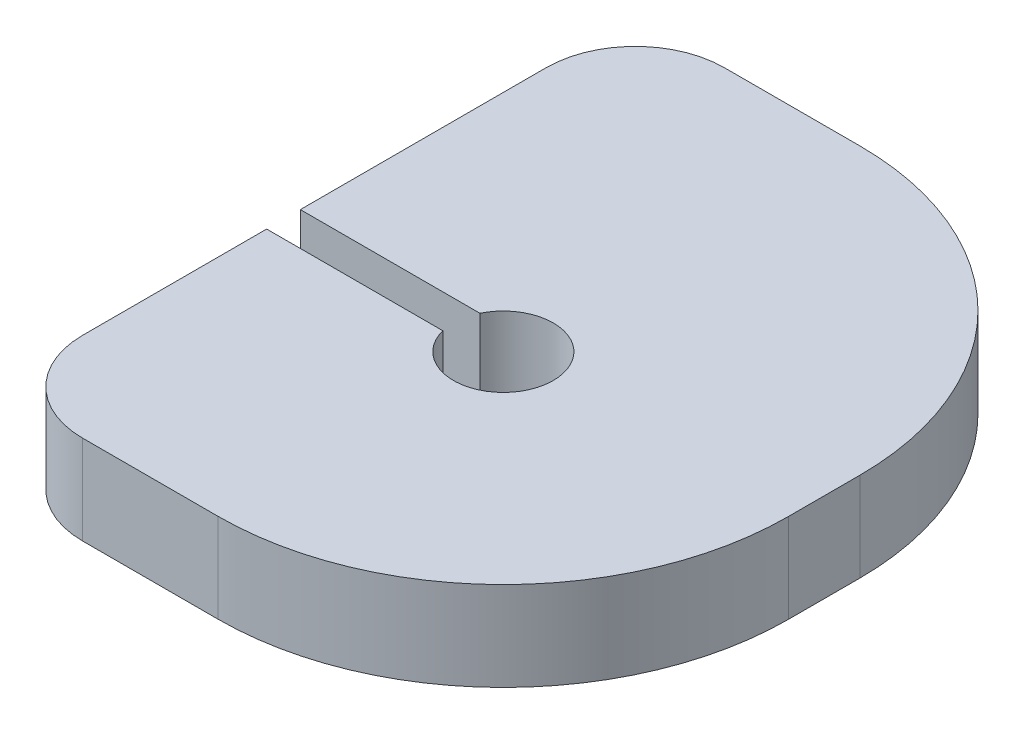
ISO-10303-21;
HEADER;
FILE_DESCRIPTION(('STEP AP214'),'2;1');
FILE_NAME('part.step','',(''),(''),'','','');
FILE_SCHEMA(('AUTOMOTIVE_DESIGN { 1 0 10303 214 1 1 1 1 }'));
ENDSEC;
DATA;
#1=APPLICATION_CONTEXT('core data for automotive mechanical design processes');
#2=APPLICATION_PROTOCOL_DEFINITION('international standard','automotive_design',2000,#1);
#3=PRODUCT_CONTEXT('',#1,'mechanical');
#4=PRODUCT('Part','Part','',(#3));
#5=PRODUCT_RELATED_PRODUCT_CATEGORY('part','',(#4));
#6=PRODUCT_DEFINITION_FORMATION('','',#4);
#7=PRODUCT_DEFINITION_CONTEXT('part definition',#1,'design');
#8=PRODUCT_DEFINITION('design','',#6,#7);
#9=PRODUCT_DEFINITION_SHAPE('','',#8);
#10=(LENGTH_UNIT() NAMED_UNIT(*) SI_UNIT(.MILLI.,.METRE.));
#11=(NAMED_UNIT(*) PLANE_ANGLE_UNIT() SI_UNIT($,.RADIAN.));
#12=(NAMED_UNIT(*) SI_UNIT($,.STERADIAN.) SOLID_ANGLE_UNIT());
#13=UNCERTAINTY_MEASURE_WITH_UNIT(LENGTH_MEASURE(1.E-05),#10,'distance_accuracy_value','');
#14=(GEOMETRIC_REPRESENTATION_CONTEXT(3) GLOBAL_UNCERTAINTY_ASSIGNED_CONTEXT((#13)) GLOBAL_UNIT_ASSIGNED_CONTEXT((#10,
#11,#12)) REPRESENTATION_CONTEXT('',''));
#15=CARTESIAN_POINT('',(0.,0.,0.));
#16=DIRECTION('',(0.,0.,1.));
#17=DIRECTION('',(1.,0.,0.));
#18=AXIS2_PLACEMENT_3D('',#15,#16,#17);
#19=CARTESIAN_POINT('',(0.,3.175,0.));
#20=DIRECTION('',(0.,1.,0.));
#21=DIRECTION('',(0.,0.,1.));
#22=AXIS2_PLACEMENT_3D('',#19,#20,#21);
#23=PLANE('',#22);
#24=DIRECTION('',(0.,0.,-1.));
#25=VECTOR('',#24,1.);
#26=CARTESIAN_POINT('',(7.23899999999999,3.175,-11.43));
#27=LINE('',#26,#25);
#28=CARTESIAN_POINT('',(7.239,3.175,0.500889408729022));
#29=VERTEX_POINT('',#28);
#30=CARTESIAN_POINT('',(7.23899999999999,3.175,-8.255));
#31=VERTEX_POINT('',#30);
#32=EDGE_CURVE('E147',#29,#31,#27,.T.);
#33=ORIENTED_EDGE('',*,*,#32,.F.);
#34=DIRECTION('',(1.,0.,0.));
#35=VECTOR('',#34,1.);
#36=CARTESIAN_POINT('',(7.239,3.175,0.500889408729023));
#37=LINE('',#36,#35);
#38=CARTESIAN_POINT('',(13.6369551165377,3.175,0.500889408729023));
#39=VERTEX_POINT('',#38);
#40=EDGE_CURVE('E47',#29,#39,#37,.T.);
#41=ORIENTED_EDGE('',*,*,#40,.T.);
#42=CARTESIAN_POINT('',(15.24,3.175,1.27));
#43=DIRECTION('',(0.,1.,0.));
#44=DIRECTION('',(0.,0.,1.));
#45=AXIS2_PLACEMENT_3D('',#42,#43,#44);
#46=CIRCLE('',#45,1.778);
#47=CARTESIAN_POINT('',(13.5150019369735,3.175,1.70088940872902));
#48=VERTEX_POINT('',#47);
#49=EDGE_CURVE('E145',#48,#39,#46,.T.);
#50=ORIENTED_EDGE('',*,*,#49,.F.);
#51=DIRECTION('',(1.,0.,0.));
#52=VECTOR('',#51,1.);
#53=CARTESIAN_POINT('',(7.239,3.175,1.70088940872902));
#54=LINE('',#53,#52);
#55=CARTESIAN_POINT('',(7.239,3.175,1.70088940872902));
#56=VERTEX_POINT('',#55);
#57=EDGE_CURVE('E135',#56,#48,#54,.T.);
#58=ORIENTED_EDGE('',*,*,#57,.F.);
#59=CARTESIAN_POINT('',(7.239,3.175,8.255));
#60=VERTEX_POINT('',#59);
#61=EDGE_CURVE('E142',#60,#56,#27,.T.);
#62=ORIENTED_EDGE('',*,*,#61,.F.);
#63=CARTESIAN_POINT('',(10.414,3.175,8.255));
#64=DIRECTION('',(0.,1.,0.));
#65=DIRECTION('',(0.,0.,1.));
#66=AXIS2_PLACEMENT_3D('',#63,#64,#65);
#67=CIRCLE('',#66,3.175);
#68=CARTESIAN_POINT('',(10.414,3.175,11.43));
#69=VERTEX_POINT('',#68);
#70=EDGE_CURVE('E199',#60,#69,#67,.T.);
#71=ORIENTED_EDGE('',*,*,#70,.T.);
#72=DIRECTION('',(1.,0.,0.));
#73=VECTOR('',#72,1.);
#74=CARTESIAN_POINT('',(-25.4,3.175,11.43));
#75=LINE('',#74,#73);
#76=CARTESIAN_POINT('',(15.24,3.175,11.43));
#77=VERTEX_POINT('',#76);
#78=EDGE_CURVE('E157',#69,#77,#75,.T.);
#79=ORIENTED_EDGE('',*,*,#78,.T.);
#80=CARTESIAN_POINT('',(15.24,3.175,1.27));
#81=DIRECTION('',(0.,1.,0.));
#82=DIRECTION('',(0.,0.,1.));
#83=AXIS2_PLACEMENT_3D('',#80,#81,#82);
#84=CIRCLE('',#83,10.16);
#85=CARTESIAN_POINT('',(25.4,3.175,1.27));
#86=VERTEX_POINT('',#85);
#87=EDGE_CURVE('E178',#77,#86,#84,.T.);
#88=ORIENTED_EDGE('',*,*,#87,.T.);
#89=DIRECTION('',(0.,0.,-1.));
#90=VECTOR('',#89,1.);
#91=CARTESIAN_POINT('',(25.4,3.175,-11.43));
#92=LINE('',#91,#90);
#93=CARTESIAN_POINT('',(25.4,3.175,-1.27));
#94=VERTEX_POINT('',#93);
#95=EDGE_CURVE('E159',#86,#94,#92,.T.);
#96=ORIENTED_EDGE('',*,*,#95,.T.);
#97=CARTESIAN_POINT('',(15.24,3.175,-1.27));
#98=DIRECTION('',(0.,1.,0.));
#99=DIRECTION('',(0.,0.,1.));
#100=AXIS2_PLACEMENT_3D('',#97,#98,#99);
#101=CIRCLE('',#100,10.16);
#102=CARTESIAN_POINT('',(15.24,3.175,-11.43));
#103=VERTEX_POINT('',#102);
#104=EDGE_CURVE('E188',#94,#103,#101,.T.);
#105=ORIENTED_EDGE('',*,*,#104,.T.);
#106=DIRECTION('',(-1.,0.,0.));
#107=VECTOR('',#106,1.);
#108=CARTESIAN_POINT('',(-25.4,3.175,-11.43));
#109=LINE('',#108,#107);
#110=CARTESIAN_POINT('',(10.414,3.175,-11.43));
#111=VERTEX_POINT('',#110);
#112=EDGE_CURVE('E163',#103,#111,#109,.T.);
#113=ORIENTED_EDGE('',*,*,#112,.T.);
#114=CARTESIAN_POINT('',(10.414,3.175,-8.255));
#115=DIRECTION('',(0.,1.,0.));
#116=DIRECTION('',(0.,0.,1.));
#117=AXIS2_PLACEMENT_3D('',#114,#115,#116);
#118=CIRCLE('',#117,3.175);
#119=EDGE_CURVE('E196',#111,#31,#118,.T.);
#120=ORIENTED_EDGE('',*,*,#119,.T.);
#121=EDGE_LOOP('',(#33,#41,#50,#58,#62,#71,#79,#88,#96,#105,#113,#120));
#122=FACE_BOUND('',#121,.T.);
#123=ADVANCED_FACE('F32',(#122),#23,.T.);
#124=CARTESIAN_POINT('',(0.,0.,0.));
#125=DIRECTION('',(0.,1.,0.));
#126=DIRECTION('',(0.,0.,1.));
#127=AXIS2_PLACEMENT_3D('',#124,#125,#126);
#128=PLANE('',#127);
#129=DIRECTION('',(1.,0.,0.));
#130=VECTOR('',#129,1.);
#131=CARTESIAN_POINT('',(7.239,0.,0.500889408729023));
#132=LINE('',#131,#130);
#133=CARTESIAN_POINT('',(7.239,0.,0.500889408729023));
#134=VERTEX_POINT('',#133);
#135=CARTESIAN_POINT('',(13.6369551165377,0.,0.500889408729023));
#136=VERTEX_POINT('',#135);
#137=EDGE_CURVE('E121',#134,#136,#132,.T.);
#138=ORIENTED_EDGE('',*,*,#137,.F.);
#139=DIRECTION('',(0.,0.,-1.));
#140=VECTOR('',#139,1.);
#141=CARTESIAN_POINT('',(7.23899999999999,0.,-11.43));
#142=LINE('',#141,#140);
#143=CARTESIAN_POINT('',(7.23899999999999,0.,-8.255));
#144=VERTEX_POINT('',#143);
#145=EDGE_CURVE('E131',#134,#144,#142,.T.);
#146=ORIENTED_EDGE('',*,*,#145,.T.);
#147=CARTESIAN_POINT('',(10.414,0.,-8.255));
#148=DIRECTION('',(0.,1.,0.));
#149=DIRECTION('',(0.,0.,1.));
#150=AXIS2_PLACEMENT_3D('',#147,#148,#149);
#151=CIRCLE('',#150,3.175);
#152=CARTESIAN_POINT('',(10.414,0.,-11.43));
#153=VERTEX_POINT('',#152);
#154=EDGE_CURVE('E203',#144,#153,#151,.F.);
#155=ORIENTED_EDGE('',*,*,#154,.T.);
#156=DIRECTION('',(-1.,0.,0.));
#157=VECTOR('',#156,1.);
#158=CARTESIAN_POINT('',(-25.4,0.,-11.43));
#159=LINE('',#158,#157);
#160=CARTESIAN_POINT('',(15.24,0.,-11.43));
#161=VERTEX_POINT('',#160);
#162=EDGE_CURVE('E160',#161,#153,#159,.T.);
#163=ORIENTED_EDGE('',*,*,#162,.F.);
#164=CARTESIAN_POINT('',(15.24,0.,-1.27));
#165=DIRECTION('',(0.,1.,0.));
#166=DIRECTION('',(0.,0.,1.));
#167=AXIS2_PLACEMENT_3D('',#164,#165,#166);
#168=CIRCLE('',#167,10.16);
#169=CARTESIAN_POINT('',(25.4,0.,-1.27));
#170=VERTEX_POINT('',#169);
#171=EDGE_CURVE('E183',#161,#170,#168,.F.);
#172=ORIENTED_EDGE('',*,*,#171,.T.);
#173=DIRECTION('',(0.,0.,-1.));
#174=VECTOR('',#173,1.);
#175=CARTESIAN_POINT('',(25.4,0.,-11.43));
#176=LINE('',#175,#174);
#177=CARTESIAN_POINT('',(25.4,0.,1.27));
#178=VERTEX_POINT('',#177);
#179=EDGE_CURVE('E168',#178,#170,#176,.T.);
#180=ORIENTED_EDGE('',*,*,#179,.F.);
#181=CARTESIAN_POINT('',(15.24,0.,1.27));
#182=DIRECTION('',(0.,1.,0.));
#183=DIRECTION('',(0.,0.,1.));
#184=AXIS2_PLACEMENT_3D('',#181,#182,#183);
#185=CIRCLE('',#184,10.16);
#186=CARTESIAN_POINT('',(15.24,0.,11.43));
#187=VERTEX_POINT('',#186);
#188=EDGE_CURVE('E175',#178,#187,#185,.F.);
#189=ORIENTED_EDGE('',*,*,#188,.T.);
#190=DIRECTION('',(1.,0.,0.));
#191=VECTOR('',#190,1.);
#192=CARTESIAN_POINT('',(-25.4,0.,11.43));
#193=LINE('',#192,#191);
#194=CARTESIAN_POINT('',(10.414,0.,11.43));
#195=VERTEX_POINT('',#194);
#196=EDGE_CURVE('E154',#195,#187,#193,.T.);
#197=ORIENTED_EDGE('',*,*,#196,.F.);
#198=CARTESIAN_POINT('',(10.414,0.,8.255));
#199=DIRECTION('',(0.,1.,0.));
#200=DIRECTION('',(0.,0.,1.));
#201=AXIS2_PLACEMENT_3D('',#198,#199,#200);
#202=CIRCLE('',#201,3.175);
#203=CARTESIAN_POINT('',(7.239,0.,8.255));
#204=VERTEX_POINT('',#203);
#205=EDGE_CURVE('E40',#195,#204,#202,.F.);
#206=ORIENTED_EDGE('',*,*,#205,.T.);
#207=CARTESIAN_POINT('',(7.239,0.,1.70088940872902));
#208=VERTEX_POINT('',#207);
#209=EDGE_CURVE('E141',#204,#208,#142,.T.);
#210=ORIENTED_EDGE('',*,*,#209,.T.);
#211=DIRECTION('',(1.,0.,0.));
#212=VECTOR('',#211,1.);
#213=CARTESIAN_POINT('',(7.239,0.,1.70088940872902));
#214=LINE('',#213,#212);
#215=CARTESIAN_POINT('',(13.5150019369735,0.,1.70088940872902));
#216=VERTEX_POINT('',#215);
#217=EDGE_CURVE('E55',#208,#216,#214,.T.);
#218=ORIENTED_EDGE('',*,*,#217,.T.);
#219=CARTESIAN_POINT('',(15.24,0.,1.27));
#220=DIRECTION('',(0.,1.,0.));
#221=DIRECTION('',(0.,0.,1.));
#222=AXIS2_PLACEMENT_3D('',#219,#220,#221);
#223=CIRCLE('',#222,1.778);
#224=EDGE_CURVE('E134',#216,#136,#223,.T.);
#225=ORIENTED_EDGE('',*,*,#224,.T.);
#226=EDGE_LOOP('',(#138,#146,#155,#163,#172,#180,#189,#197,#206,#210,#218,#225));
#227=FACE_BOUND('',#226,.T.);
#228=ADVANCED_FACE('F130',(#227),#128,.F.);
#229=CARTESIAN_POINT('',(15.24,0.,1.27));
#230=DIRECTION('',(0.,1.,0.));
#231=DIRECTION('',(0.,0.,1.));
#232=AXIS2_PLACEMENT_3D('',#229,#230,#231);
#233=CYLINDRICAL_SURFACE('',#232,1.778);
#234=DIRECTION('',(0.,1.,0.));
#235=VECTOR('',#234,1.);
#236=CARTESIAN_POINT('',(13.6369551165377,0.,0.500889408729023));
#237=LINE('',#236,#235);
#238=EDGE_CURVE('E150',#136,#39,#237,.T.);
#239=ORIENTED_EDGE('',*,*,#238,.F.);
#240=ORIENTED_EDGE('',*,*,#224,.F.);
#241=DIRECTION('',(0.,1.,0.));
#242=VECTOR('',#241,1.);
#243=CARTESIAN_POINT('',(13.5150019369735,0.,1.70088940872902));
#244=LINE('',#243,#242);
#245=EDGE_CURVE('E240',#216,#48,#244,.T.);
#246=ORIENTED_EDGE('',*,*,#245,.T.);
#247=ORIENTED_EDGE('',*,*,#49,.T.);
#248=EDGE_LOOP('',(#239,#240,#246,#247));
#249=FACE_BOUND('',#248,.T.);
#250=ADVANCED_FACE('F247',(#249),#233,.F.);
#251=CARTESIAN_POINT('',(7.23899999999999,0.,-11.43));
#252=DIRECTION('',(1.,0.,0.));
#253=DIRECTION('',(0.,0.,-1.));
#254=AXIS2_PLACEMENT_3D('',#251,#252,#253);
#255=PLANE('',#254);
#256=DIRECTION('',(0.,1.,0.));
#257=VECTOR('',#256,1.);
#258=CARTESIAN_POINT('',(7.239,0.,0.500889408729023));
#259=LINE('',#258,#257);
#260=EDGE_CURVE('E118',#134,#29,#259,.T.);
#261=ORIENTED_EDGE('',*,*,#260,.T.);
#262=ORIENTED_EDGE('',*,*,#32,.T.);
#263=DIRECTION('',(0.,1.,0.));
#264=VECTOR('',#263,1.);
#265=CARTESIAN_POINT('',(7.23899999999999,0.,-8.255));
#266=LINE('',#265,#264);
#267=EDGE_CURVE('E139',#31,#144,#266,.F.);
#268=ORIENTED_EDGE('',*,*,#267,.T.);
#269=ORIENTED_EDGE('',*,*,#145,.F.);
#270=EDGE_LOOP('',(#261,#262,#268,#269));
#271=FACE_BOUND('',#270,.T.);
#272=ADVANCED_FACE('F137',(#271),#255,.F.);
#273=CARTESIAN_POINT('',(-25.4,3.175,11.43));
#274=DIRECTION('',(0.,0.,-1.));
#275=DIRECTION('',(-1.,0.,0.));
#276=AXIS2_PLACEMENT_3D('',#273,#274,#275);
#277=PLANE('',#276);
#278=ORIENTED_EDGE('',*,*,#78,.F.);
#279=DIRECTION('',(0.,1.,0.));
#280=VECTOR('',#279,1.);
#281=CARTESIAN_POINT('',(10.414,3.175,11.43));
#282=LINE('',#281,#280);
#283=EDGE_CURVE('E201',#69,#195,#282,.F.);
#284=ORIENTED_EDGE('',*,*,#283,.T.);
#285=ORIENTED_EDGE('',*,*,#196,.T.);
#286=DIRECTION('',(0.,-1.,0.));
#287=VECTOR('',#286,1.);
#288=CARTESIAN_POINT('',(15.24,3.175,11.43));
#289=LINE('',#288,#287);
#290=EDGE_CURVE('E166',#187,#77,#289,.F.);
#291=ORIENTED_EDGE('',*,*,#290,.T.);
#292=EDGE_LOOP('',(#278,#284,#285,#291));
#293=FACE_BOUND('',#292,.T.);
#294=ADVANCED_FACE('F218',(#293),#277,.F.);
#295=CARTESIAN_POINT('',(25.4,3.175,-11.43));
#296=DIRECTION('',(-1.,0.,0.));
#297=DIRECTION('',(0.,0.,1.));
#298=AXIS2_PLACEMENT_3D('',#295,#296,#297);
#299=PLANE('',#298);
#300=ORIENTED_EDGE('',*,*,#179,.T.);
#301=DIRECTION('',(0.,-1.,0.));
#302=VECTOR('',#301,1.);
#303=CARTESIAN_POINT('',(25.4,3.175,-1.27));
#304=LINE('',#303,#302);
#305=EDGE_CURVE('E190',#170,#94,#304,.F.);
#306=ORIENTED_EDGE('',*,*,#305,.T.);
#307=ORIENTED_EDGE('',*,*,#95,.F.);
#308=DIRECTION('',(0.,-1.,0.));
#309=VECTOR('',#308,1.);
#310=CARTESIAN_POINT('',(25.4,3.175,1.27));
#311=LINE('',#310,#309);
#312=EDGE_CURVE('E180',#86,#178,#311,.T.);
#313=ORIENTED_EDGE('',*,*,#312,.T.);
#314=EDGE_LOOP('',(#300,#306,#307,#313));
#315=FACE_BOUND('',#314,.T.);
#316=ADVANCED_FACE('F227',(#315),#299,.F.);
#317=CARTESIAN_POINT('',(-25.4,3.175,-11.43));
#318=DIRECTION('',(0.,0.,1.));
#319=DIRECTION('',(1.,0.,0.));
#320=AXIS2_PLACEMENT_3D('',#317,#318,#319);
#321=PLANE('',#320);
#322=ORIENTED_EDGE('',*,*,#162,.T.);
#323=DIRECTION('',(0.,1.,0.));
#324=VECTOR('',#323,1.);
#325=CARTESIAN_POINT('',(10.414,3.175,-11.43));
#326=LINE('',#325,#324);
#327=EDGE_CURVE('E11',#153,#111,#326,.T.);
#328=ORIENTED_EDGE('',*,*,#327,.T.);
#329=ORIENTED_EDGE('',*,*,#112,.F.);
#330=DIRECTION('',(0.,-1.,0.));
#331=VECTOR('',#330,1.);
#332=CARTESIAN_POINT('',(15.24,3.175,-11.43));
#333=LINE('',#332,#331);
#334=EDGE_CURVE('E185',#103,#161,#333,.T.);
#335=ORIENTED_EDGE('',*,*,#334,.T.);
#336=EDGE_LOOP('',(#322,#328,#329,#335));
#337=FACE_BOUND('',#336,.T.);
#338=ADVANCED_FACE('F235',(#337),#321,.F.);
#339=CARTESIAN_POINT('',(15.24,3.175,1.27));
#340=DIRECTION('',(0.,-1.,0.));
#341=DIRECTION('',(0.,0.,-1.));
#342=AXIS2_PLACEMENT_3D('',#339,#340,#341);
#343=CYLINDRICAL_SURFACE('',#342,10.16);
#344=ORIENTED_EDGE('',*,*,#87,.F.);
#345=ORIENTED_EDGE('',*,*,#290,.F.);
#346=ORIENTED_EDGE('',*,*,#188,.F.);
#347=ORIENTED_EDGE('',*,*,#312,.F.);
#348=EDGE_LOOP('',(#344,#345,#346,#347));
#349=FACE_BOUND('',#348,.T.);
#350=ADVANCED_FACE('F223',(#349),#343,.T.);
#351=CARTESIAN_POINT('',(15.24,3.175,-1.27));
#352=DIRECTION('',(0.,-1.,0.));
#353=DIRECTION('',(0.,0.,-1.));
#354=AXIS2_PLACEMENT_3D('',#351,#352,#353);
#355=CYLINDRICAL_SURFACE('',#354,10.16);
#356=ORIENTED_EDGE('',*,*,#104,.F.);
#357=ORIENTED_EDGE('',*,*,#305,.F.);
#358=ORIENTED_EDGE('',*,*,#171,.F.);
#359=ORIENTED_EDGE('',*,*,#334,.F.);
#360=EDGE_LOOP('',(#356,#357,#358,#359));
#361=FACE_BOUND('',#360,.T.);
#362=ADVANCED_FACE('F231',(#361),#355,.T.);
#363=ORIENTED_EDGE('',*,*,#61,.T.);
#364=DIRECTION('',(0.,1.,0.));
#365=VECTOR('',#364,1.);
#366=CARTESIAN_POINT('',(7.239,0.,1.70088940872902));
#367=LINE('',#366,#365);
#368=EDGE_CURVE('E126',#208,#56,#367,.T.);
#369=ORIENTED_EDGE('',*,*,#368,.F.);
#370=ORIENTED_EDGE('',*,*,#209,.F.);
#371=DIRECTION('',(0.,1.,0.));
#372=VECTOR('',#371,1.);
#373=CARTESIAN_POINT('',(7.239,0.,8.255));
#374=LINE('',#373,#372);
#375=EDGE_CURVE('E193',#204,#60,#374,.T.);
#376=ORIENTED_EDGE('',*,*,#375,.T.);
#377=EDGE_LOOP('',(#363,#369,#370,#376));
#378=FACE_BOUND('',#377,.T.);
#379=ADVANCED_FACE('F211',(#378),#255,.F.);
#380=CARTESIAN_POINT('',(10.414,0.,8.255));
#381=DIRECTION('',(0.,1.,0.));
#382=DIRECTION('',(0.,0.,1.));
#383=AXIS2_PLACEMENT_3D('',#380,#381,#382);
#384=CYLINDRICAL_SURFACE('',#383,3.175);
#385=ORIENTED_EDGE('',*,*,#205,.F.);
#386=ORIENTED_EDGE('',*,*,#283,.F.);
#387=ORIENTED_EDGE('',*,*,#70,.F.);
#388=ORIENTED_EDGE('',*,*,#375,.F.);
#389=EDGE_LOOP('',(#385,#386,#387,#388));
#390=FACE_BOUND('',#389,.T.);
#391=ADVANCED_FACE('F213',(#390),#384,.T.);
#392=CARTESIAN_POINT('',(10.414,3.175,-8.255));
#393=DIRECTION('',(0.,1.,0.));
#394=DIRECTION('',(0.,0.,1.));
#395=AXIS2_PLACEMENT_3D('',#392,#393,#394);
#396=CYLINDRICAL_SURFACE('',#395,3.175);
#397=ORIENTED_EDGE('',*,*,#154,.F.);
#398=ORIENTED_EDGE('',*,*,#267,.F.);
#399=ORIENTED_EDGE('',*,*,#119,.F.);
#400=ORIENTED_EDGE('',*,*,#327,.F.);
#401=EDGE_LOOP('',(#397,#398,#399,#400));
#402=FACE_BOUND('',#401,.T.);
#403=ADVANCED_FACE('F34',(#402),#396,.T.);
#404=CARTESIAN_POINT('',(7.239,0.,1.70088940872902));
#405=DIRECTION('',(0.,0.,1.));
#406=DIRECTION('',(1.,0.,0.));
#407=AXIS2_PLACEMENT_3D('',#404,#405,#406);
#408=PLANE('',#407);
#409=ORIENTED_EDGE('',*,*,#217,.F.);
#410=ORIENTED_EDGE('',*,*,#368,.T.);
#411=ORIENTED_EDGE('',*,*,#57,.T.);
#412=ORIENTED_EDGE('',*,*,#245,.F.);
#413=EDGE_LOOP('',(#409,#410,#411,#412));
#414=FACE_BOUND('',#413,.T.);
#415=ADVANCED_FACE('F248',(#414),#408,.F.);
#416=CARTESIAN_POINT('',(7.239,0.,0.500889408729023));
#417=DIRECTION('',(0.,0.,1.));
#418=DIRECTION('',(1.,0.,0.));
#419=AXIS2_PLACEMENT_3D('',#416,#417,#418);
#420=PLANE('',#419);
#421=ORIENTED_EDGE('',*,*,#238,.T.);
#422=ORIENTED_EDGE('',*,*,#40,.F.);
#423=ORIENTED_EDGE('',*,*,#260,.F.);
#424=ORIENTED_EDGE('',*,*,#137,.T.);
#425=EDGE_LOOP('',(#421,#422,#423,#424));
#426=FACE_BOUND('',#425,.T.);
#427=ADVANCED_FACE('F120',(#426),#420,.T.);
#428=CLOSED_SHELL('',(#123,#228,#250,#272,#294,#316,#338,#350,#362,#379,#391,#403,#415,#427));
#429=MANIFOLD_SOLID_BREP('B2',#428);
#430=ADVANCED_BREP_SHAPE_REPRESENTATION('',(#18,#429),#14);
#431=SHAPE_DEFINITION_REPRESENTATION(#9,#430);
ENDSEC;
END-ISO-10303-21;
